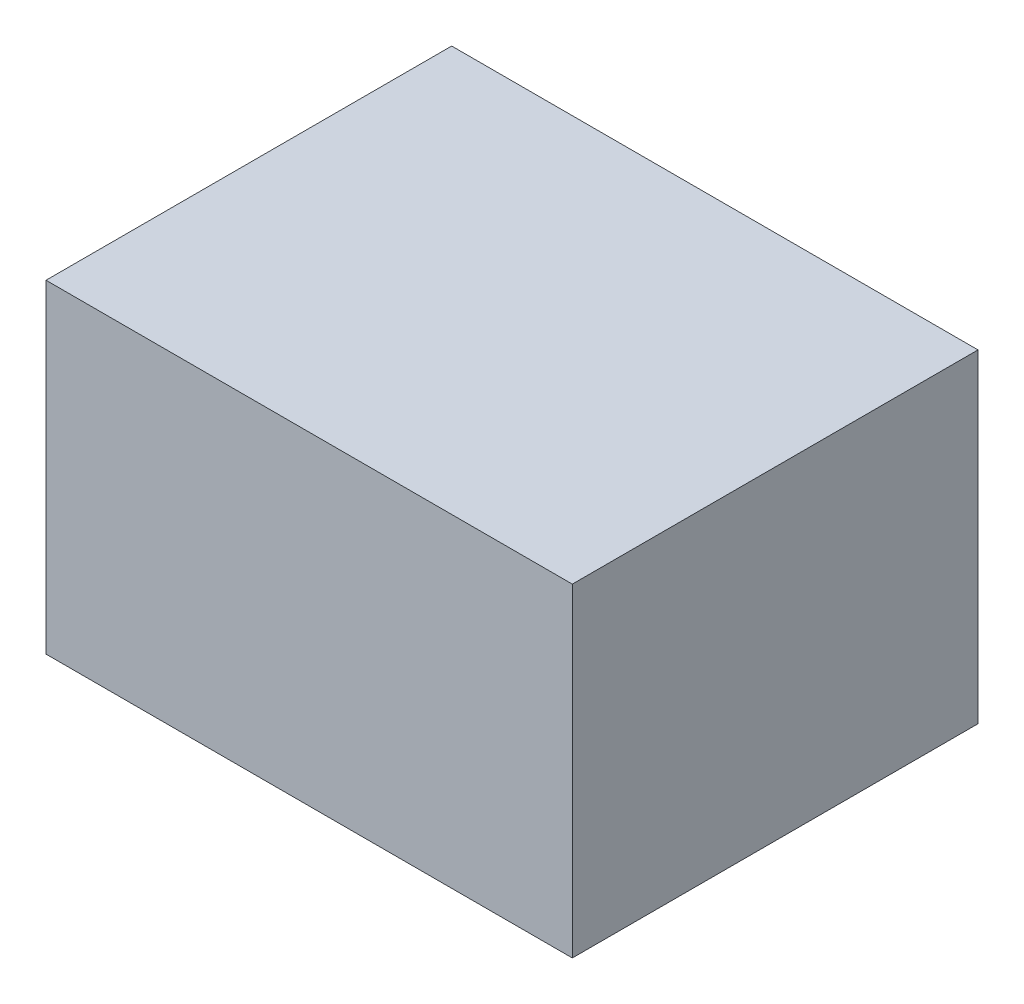
ISO-10303-21;
HEADER;
FILE_DESCRIPTION(('STEP AP214'),'2;1');
FILE_NAME('part.step','',(''),(''),'','','');
FILE_SCHEMA(('AUTOMOTIVE_DESIGN { 1 0 10303 214 1 1 1 1 }'));
ENDSEC;
DATA;
#1=APPLICATION_CONTEXT('core data for automotive mechanical design processes');
#2=APPLICATION_PROTOCOL_DEFINITION('international standard','automotive_design',2000,#1);
#3=PRODUCT_CONTEXT('',#1,'mechanical');
#4=PRODUCT('Part','Part','',(#3));
#5=PRODUCT_RELATED_PRODUCT_CATEGORY('part','',(#4));
#6=PRODUCT_DEFINITION_FORMATION('','',#4);
#7=PRODUCT_DEFINITION_CONTEXT('part definition',#1,'design');
#8=PRODUCT_DEFINITION('design','',#6,#7);
#9=PRODUCT_DEFINITION_SHAPE('','',#8);
#10=(LENGTH_UNIT() NAMED_UNIT(*) SI_UNIT(.MILLI.,.METRE.));
#11=(NAMED_UNIT(*) PLANE_ANGLE_UNIT() SI_UNIT($,.RADIAN.));
#12=(NAMED_UNIT(*) SI_UNIT($,.STERADIAN.) SOLID_ANGLE_UNIT());
#13=UNCERTAINTY_MEASURE_WITH_UNIT(LENGTH_MEASURE(1.E-05),#10,'distance_accuracy_value','');
#14=(GEOMETRIC_REPRESENTATION_CONTEXT(3) GLOBAL_UNCERTAINTY_ASSIGNED_CONTEXT((#13)) GLOBAL_UNIT_ASSIGNED_CONTEXT((#10,
#11,#12)) REPRESENTATION_CONTEXT('',''));
#15=CARTESIAN_POINT('',(0.,0.,0.));
#16=DIRECTION('',(0.,0.,1.));
#17=DIRECTION('',(1.,0.,0.));
#18=AXIS2_PLACEMENT_3D('',#15,#16,#17);
#19=CARTESIAN_POINT('',(42.2636997532134,52.,32.5757456550555));
#20=DIRECTION('',(-1.,0.,0.));
#21=DIRECTION('',(0.,0.,1.));
#22=AXIS2_PLACEMENT_3D('',#19,#20,#21);
#23=PLANE('',#22);
#24=DIRECTION('',(0.,0.,-1.));
#25=VECTOR('',#24,1.);
#26=CARTESIAN_POINT('',(42.2636997532134,0.,32.5757456550555));
#27=LINE('',#26,#25);
#28=CARTESIAN_POINT('',(42.2636997532134,0.,32.5757456550555));
#29=VERTEX_POINT('',#28);
#30=CARTESIAN_POINT('',(42.2636997532134,0.,-32.5757456550555));
#31=VERTEX_POINT('',#30);
#32=EDGE_CURVE('E97',#29,#31,#27,.T.);
#33=ORIENTED_EDGE('',*,*,#32,.T.);
#34=DIRECTION('',(0.,-1.,0.));
#35=VECTOR('',#34,1.);
#36=CARTESIAN_POINT('',(42.2636997532134,52.,-32.5757456550555));
#37=LINE('',#36,#35);
#38=CARTESIAN_POINT('',(42.2636997532134,52.,-32.5757456550555));
#39=VERTEX_POINT('',#38);
#40=EDGE_CURVE('E11',#39,#31,#37,.T.);
#41=ORIENTED_EDGE('',*,*,#40,.F.);
#42=DIRECTION('',(0.,0.,-1.));
#43=VECTOR('',#42,1.);
#44=CARTESIAN_POINT('',(42.2636997532134,52.,32.5757456550555));
#45=LINE('',#44,#43);
#46=CARTESIAN_POINT('',(42.2636997532134,52.,32.5757456550555));
#47=VERTEX_POINT('',#46);
#48=EDGE_CURVE('E85',#47,#39,#45,.T.);
#49=ORIENTED_EDGE('',*,*,#48,.F.);
#50=DIRECTION('',(0.,-1.,0.));
#51=VECTOR('',#50,1.);
#52=CARTESIAN_POINT('',(42.2636997532134,52.,32.5757456550555));
#53=LINE('',#52,#51);
#54=EDGE_CURVE('E93',#47,#29,#53,.T.);
#55=ORIENTED_EDGE('',*,*,#54,.T.);
#56=EDGE_LOOP('',(#33,#41,#49,#55));
#57=FACE_BOUND('',#56,.T.);
#58=ADVANCED_FACE('F34',(#57),#23,.F.);
#59=CARTESIAN_POINT('',(-42.2636997532134,52.,-32.5757456550555));
#60=DIRECTION('',(0.,0.,1.));
#61=DIRECTION('',(1.,0.,0.));
#62=AXIS2_PLACEMENT_3D('',#59,#60,#61);
#63=PLANE('',#62);
#64=DIRECTION('',(-1.,0.,0.));
#65=VECTOR('',#64,1.);
#66=CARTESIAN_POINT('',(-42.2636997532134,0.,-32.5757456550555));
#67=LINE('',#66,#65);
#68=CARTESIAN_POINT('',(-42.2636997532134,0.,-32.5757456550555));
#69=VERTEX_POINT('',#68);
#70=EDGE_CURVE('E89',#31,#69,#67,.T.);
#71=ORIENTED_EDGE('',*,*,#70,.T.);
#72=DIRECTION('',(0.,-1.,0.));
#73=VECTOR('',#72,1.);
#74=CARTESIAN_POINT('',(-42.2636997532134,52.,-32.5757456550555));
#75=LINE('',#74,#73);
#76=CARTESIAN_POINT('',(-42.2636997532134,52.,-32.5757456550555));
#77=VERTEX_POINT('',#76);
#78=EDGE_CURVE('E42',#77,#69,#75,.T.);
#79=ORIENTED_EDGE('',*,*,#78,.F.);
#80=DIRECTION('',(-1.,0.,0.));
#81=VECTOR('',#80,1.);
#82=CARTESIAN_POINT('',(-42.2636997532134,52.,-32.5757456550555));
#83=LINE('',#82,#81);
#84=EDGE_CURVE('E80',#39,#77,#83,.T.);
#85=ORIENTED_EDGE('',*,*,#84,.F.);
#86=ORIENTED_EDGE('',*,*,#40,.T.);
#87=EDGE_LOOP('',(#71,#79,#85,#86));
#88=FACE_BOUND('',#87,.T.);
#89=ADVANCED_FACE('F88',(#88),#63,.F.);
#90=CARTESIAN_POINT('',(-42.2636997532134,52.,32.5757456550555));
#91=DIRECTION('',(1.,0.,0.));
#92=DIRECTION('',(0.,0.,-1.));
#93=AXIS2_PLACEMENT_3D('',#90,#91,#92);
#94=PLANE('',#93);
#95=DIRECTION('',(0.,0.,1.));
#96=VECTOR('',#95,1.);
#97=CARTESIAN_POINT('',(-42.2636997532134,0.,32.5757456550555));
#98=LINE('',#97,#96);
#99=CARTESIAN_POINT('',(-42.2636997532134,0.,32.5757456550555));
#100=VERTEX_POINT('',#99);
#101=EDGE_CURVE('E67',#69,#100,#98,.T.);
#102=ORIENTED_EDGE('',*,*,#101,.T.);
#103=DIRECTION('',(0.,-1.,0.));
#104=VECTOR('',#103,1.);
#105=CARTESIAN_POINT('',(-42.2636997532134,52.,32.5757456550555));
#106=LINE('',#105,#104);
#107=CARTESIAN_POINT('',(-42.2636997532134,52.,32.5757456550555));
#108=VERTEX_POINT('',#107);
#109=EDGE_CURVE('E90',#108,#100,#106,.T.);
#110=ORIENTED_EDGE('',*,*,#109,.F.);
#111=DIRECTION('',(0.,0.,1.));
#112=VECTOR('',#111,1.);
#113=CARTESIAN_POINT('',(-42.2636997532134,52.,32.5757456550555));
#114=LINE('',#113,#112);
#115=EDGE_CURVE('E83',#77,#108,#114,.T.);
#116=ORIENTED_EDGE('',*,*,#115,.F.);
#117=ORIENTED_EDGE('',*,*,#78,.T.);
#118=EDGE_LOOP('',(#102,#110,#116,#117));
#119=FACE_BOUND('',#118,.T.);
#120=ADVANCED_FACE('F91',(#119),#94,.F.);
#121=CARTESIAN_POINT('',(-42.2636997532134,52.,32.5757456550555));
#122=DIRECTION('',(0.,0.,-1.));
#123=DIRECTION('',(-1.,0.,0.));
#124=AXIS2_PLACEMENT_3D('',#121,#122,#123);
#125=PLANE('',#124);
#126=DIRECTION('',(1.,0.,0.));
#127=VECTOR('',#126,1.);
#128=CARTESIAN_POINT('',(-42.2636997532134,0.,32.5757456550555));
#129=LINE('',#128,#127);
#130=EDGE_CURVE('E73',#100,#29,#129,.T.);
#131=ORIENTED_EDGE('',*,*,#130,.T.);
#132=ORIENTED_EDGE('',*,*,#54,.F.);
#133=DIRECTION('',(1.,0.,0.));
#134=VECTOR('',#133,1.);
#135=CARTESIAN_POINT('',(-42.2636997532134,52.,32.5757456550555));
#136=LINE('',#135,#134);
#137=EDGE_CURVE('E50',#108,#47,#136,.T.);
#138=ORIENTED_EDGE('',*,*,#137,.F.);
#139=ORIENTED_EDGE('',*,*,#109,.T.);
#140=EDGE_LOOP('',(#131,#132,#138,#139));
#141=FACE_BOUND('',#140,.T.);
#142=ADVANCED_FACE('F104',(#141),#125,.F.);
#143=CARTESIAN_POINT('',(0.,52.,0.));
#144=DIRECTION('',(0.,-1.,0.));
#145=DIRECTION('',(0.,0.,-1.));
#146=AXIS2_PLACEMENT_3D('',#143,#144,#145);
#147=PLANE('',#146);
#148=ORIENTED_EDGE('',*,*,#48,.T.);
#149=ORIENTED_EDGE('',*,*,#84,.T.);
#150=ORIENTED_EDGE('',*,*,#115,.T.);
#151=ORIENTED_EDGE('',*,*,#137,.T.);
#152=EDGE_LOOP('',(#148,#149,#150,#151));
#153=FACE_BOUND('',#152,.T.);
#154=ADVANCED_FACE('F81',(#153),#147,.F.);
#155=CARTESIAN_POINT('',(0.,0.,0.));
#156=DIRECTION('',(0.,-1.,0.));
#157=DIRECTION('',(0.,0.,-1.));
#158=AXIS2_PLACEMENT_3D('',#155,#156,#157);
#159=PLANE('',#158);
#160=ORIENTED_EDGE('',*,*,#32,.F.);
#161=ORIENTED_EDGE('',*,*,#130,.F.);
#162=ORIENTED_EDGE('',*,*,#101,.F.);
#163=ORIENTED_EDGE('',*,*,#70,.F.);
#164=EDGE_LOOP('',(#160,#161,#162,#163));
#165=FACE_BOUND('',#164,.T.);
#166=ADVANCED_FACE('F107',(#165),#159,.T.);
#167=CLOSED_SHELL('',(#58,#89,#120,#142,#154,#166));
#168=MANIFOLD_SOLID_BREP('B2',#167);
#169=ADVANCED_BREP_SHAPE_REPRESENTATION('',(#18,#168),#14);
#170=SHAPE_DEFINITION_REPRESENTATION(#9,#169);
ENDSEC;
END-ISO-10303-21;
